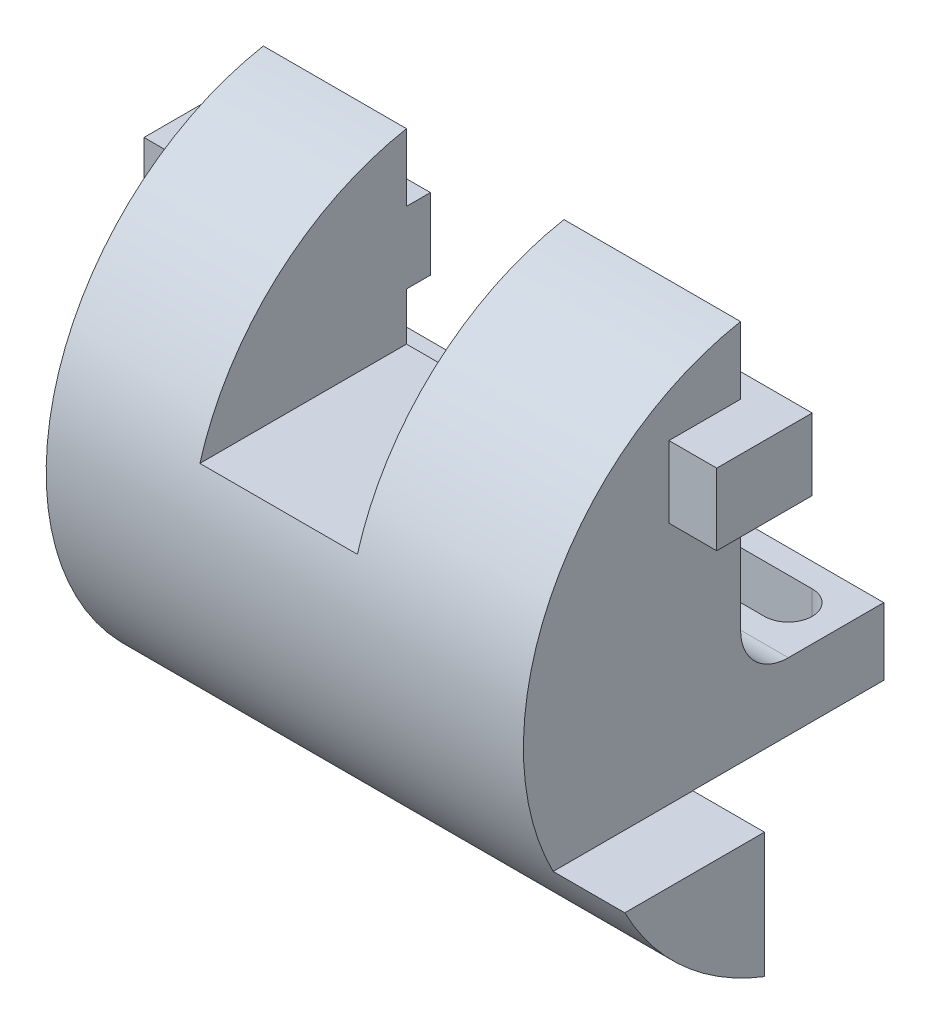
ISO-10303-21;
HEADER;
FILE_DESCRIPTION(('STEP AP214'),'2;1');
FILE_NAME('part.step','',(''),(''),'','','');
FILE_SCHEMA(('AUTOMOTIVE_DESIGN { 1 0 10303 214 1 1 1 1 }'));
ENDSEC;
DATA;
#1=APPLICATION_CONTEXT('core data for automotive mechanical design processes');
#2=APPLICATION_PROTOCOL_DEFINITION('international standard','automotive_design',2000,#1);
#3=PRODUCT_CONTEXT('',#1,'mechanical');
#4=PRODUCT('Part','Part','',(#3));
#5=PRODUCT_RELATED_PRODUCT_CATEGORY('part','',(#4));
#6=PRODUCT_DEFINITION_FORMATION('','',#4);
#7=PRODUCT_DEFINITION_CONTEXT('part definition',#1,'design');
#8=PRODUCT_DEFINITION('design','',#6,#7);
#9=PRODUCT_DEFINITION_SHAPE('','',#8);
#10=(LENGTH_UNIT() NAMED_UNIT(*) SI_UNIT(.MILLI.,.METRE.));
#11=(NAMED_UNIT(*) PLANE_ANGLE_UNIT() SI_UNIT($,.RADIAN.));
#12=(NAMED_UNIT(*) SI_UNIT($,.STERADIAN.) SOLID_ANGLE_UNIT());
#13=UNCERTAINTY_MEASURE_WITH_UNIT(LENGTH_MEASURE(1.E-05),#10,'distance_accuracy_value','');
#14=(GEOMETRIC_REPRESENTATION_CONTEXT(3) GLOBAL_UNCERTAINTY_ASSIGNED_CONTEXT((#13)) GLOBAL_UNIT_ASSIGNED_CONTEXT((#10,
#11,#12)) REPRESENTATION_CONTEXT('',''));
#15=CARTESIAN_POINT('',(0.,0.,0.));
#16=DIRECTION('',(0.,0.,1.));
#17=DIRECTION('',(1.,0.,0.));
#18=AXIS2_PLACEMENT_3D('',#15,#16,#17);
#19=CARTESIAN_POINT('',(115.,-25.7672947235158,10.));
#20=DIRECTION('',(0.,0.,1.));
#21=DIRECTION('',(1.,0.,0.));
#22=AXIS2_PLACEMENT_3D('',#19,#20,#21);
#23=PLANE('',#22);
#24=DIRECTION('',(1.,0.,0.));
#25=VECTOR('',#24,1.);
#26=CARTESIAN_POINT('',(115.,16.1410392458528,10.));
#27=LINE('',#26,#25);
#28=CARTESIAN_POINT('',(63.,16.1410392458528,9.99999999999999));
#29=VERTEX_POINT('',#28);
#30=CARTESIAN_POINT('',(100.,16.1410392458528,10.));
#31=VERTEX_POINT('',#30);
#32=EDGE_CURVE('E302',#29,#31,#27,.T.);
#33=ORIENTED_EDGE('',*,*,#32,.F.);
#34=DIRECTION('',(0.,1.,0.));
#35=VECTOR('',#34,1.);
#36=CARTESIAN_POINT('',(63.,-8.85896075414721,9.99999999999999));
#37=LINE('',#36,#35);
#38=CARTESIAN_POINT('',(63.,30.2327052764842,9.99999999999999));
#39=VERTEX_POINT('',#38);
#40=EDGE_CURVE('E343',#29,#39,#37,.T.);
#41=ORIENTED_EDGE('',*,*,#40,.T.);
#42=DIRECTION('',(-1.,0.,0.));
#43=VECTOR('',#42,1.);
#44=CARTESIAN_POINT('',(115.,30.2327052764842,9.99999999999999));
#45=LINE('',#44,#43);
#46=CARTESIAN_POINT('',(100.,30.2327052764842,10.));
#47=VERTEX_POINT('',#46);
#48=EDGE_CURVE('E408',#47,#39,#45,.T.);
#49=ORIENTED_EDGE('',*,*,#48,.F.);
#50=DIRECTION('',(0.,1.,0.));
#51=VECTOR('',#50,1.);
#52=CARTESIAN_POINT('',(100.,-25.7672947235158,10.));
#53=LINE('',#52,#51);
#54=EDGE_CURVE('E367',#31,#47,#53,.T.);
#55=ORIENTED_EDGE('',*,*,#54,.F.);
#56=EDGE_LOOP('',(#33,#41,#49,#55));
#57=FACE_BOUND('',#56,.T.);
#58=ADVANCED_FACE('F43',(#57),#23,.F.);
#59=CARTESIAN_POINT('',(63.,-8.85896075414721,9.99999999999999));
#60=VERTEX_POINT('',#59);
#61=CARTESIAN_POINT('',(63.,1.14103924585279,9.99999999999999));
#62=VERTEX_POINT('',#61);
#63=EDGE_CURVE('E349',#60,#62,#37,.T.);
#64=ORIENTED_EDGE('',*,*,#63,.T.);
#65=DIRECTION('',(1.,0.,0.));
#66=VECTOR('',#65,1.);
#67=CARTESIAN_POINT('',(115.,1.14103924585279,10.));
#68=LINE('',#67,#66);
#69=CARTESIAN_POINT('',(100.,1.14103924585279,10.));
#70=VERTEX_POINT('',#69);
#71=EDGE_CURVE('E298',#62,#70,#68,.T.);
#72=ORIENTED_EDGE('',*,*,#71,.T.);
#73=CARTESIAN_POINT('',(100.,-25.7672947235158,9.99999999999999));
#74=VERTEX_POINT('',#73);
#75=EDGE_CURVE('E368',#74,#70,#53,.T.);
#76=ORIENTED_EDGE('',*,*,#75,.F.);
#77=DIRECTION('',(-1.,0.,0.));
#78=VECTOR('',#77,1.);
#79=CARTESIAN_POINT('',(115.,-25.7672947235158,10.));
#80=LINE('',#79,#78);
#81=CARTESIAN_POINT('',(0.,-25.7672947235158,10.));
#82=VERTEX_POINT('',#81);
#83=EDGE_CURVE('E411',#74,#82,#80,.T.);
#84=ORIENTED_EDGE('',*,*,#83,.T.);
#85=DIRECTION('',(0.,1.,0.));
#86=VECTOR('',#85,1.);
#87=CARTESIAN_POINT('',(0.,-25.7672947235158,10.));
#88=LINE('',#87,#86);
#89=CARTESIAN_POINT('',(0.,1.14103924585278,10.));
#90=VERTEX_POINT('',#89);
#91=EDGE_CURVE('E386',#82,#90,#88,.T.);
#92=ORIENTED_EDGE('',*,*,#91,.T.);
#93=DIRECTION('',(-1.,0.,0.));
#94=VECTOR('',#93,1.);
#95=CARTESIAN_POINT('',(115.,1.14103924585279,10.));
#96=LINE('',#95,#94);
#97=CARTESIAN_POINT('',(30.,1.14103924585279,9.99999999999999));
#98=VERTEX_POINT('',#97);
#99=EDGE_CURVE('E58',#98,#90,#96,.T.);
#100=ORIENTED_EDGE('',*,*,#99,.F.);
#101=DIRECTION('',(0.,1.,0.));
#102=VECTOR('',#101,1.);
#103=CARTESIAN_POINT('',(30.,-8.85896075414721,9.99999999999999));
#104=LINE('',#103,#102);
#105=CARTESIAN_POINT('',(30.,-8.85896075414721,9.99999999999999));
#106=VERTEX_POINT('',#105);
#107=EDGE_CURVE('E344',#106,#98,#104,.T.);
#108=ORIENTED_EDGE('',*,*,#107,.F.);
#109=DIRECTION('',(-1.,0.,0.));
#110=VECTOR('',#109,1.);
#111=CARTESIAN_POINT('',(30.,-8.85896075414721,9.99999999999999));
#112=LINE('',#111,#110);
#113=EDGE_CURVE('E340',#60,#106,#112,.T.);
#114=ORIENTED_EDGE('',*,*,#113,.F.);
#115=EDGE_LOOP('',(#64,#72,#76,#84,#92,#100,#108,#114));
#116=FACE_BOUND('',#115,.T.);
#117=ADVANCED_FACE('F466',(#116),#23,.F.);
#118=CARTESIAN_POINT('',(100.,0.,0.));
#119=DIRECTION('',(1.,0.,0.));
#120=DIRECTION('',(0.,0.,-1.));
#121=AXIS2_PLACEMENT_3D('',#118,#119,#120);
#122=PLANE('',#121);
#123=DIRECTION('',(0.,1.,0.));
#124=VECTOR('',#123,1.);
#125=CARTESIAN_POINT('',(100.,0.,25.));
#126=LINE('',#125,#124);
#127=CARTESIAN_POINT('',(100.,1.14103924585279,25.));
#128=VERTEX_POINT('',#127);
#129=CARTESIAN_POINT('',(100.,16.1410392458528,25.));
#130=VERTEX_POINT('',#129);
#131=EDGE_CURVE('E66',#128,#130,#126,.T.);
#132=ORIENTED_EDGE('',*,*,#131,.T.);
#133=DIRECTION('',(0.,0.,-1.));
#134=VECTOR('',#133,1.);
#135=CARTESIAN_POINT('',(100.,16.1410392458528,0.));
#136=LINE('',#135,#134);
#137=EDGE_CURVE('E235',#130,#31,#136,.T.);
#138=ORIENTED_EDGE('',*,*,#137,.T.);
#139=ORIENTED_EDGE('',*,*,#54,.T.);
#140=CARTESIAN_POINT('',(100.,-24.3589607541472,0.));
#141=DIRECTION('',(1.,0.,0.));
#142=DIRECTION('',(0.,0.,-1.));
#143=AXIS2_PLACEMENT_3D('',#140,#141,#142);
#144=CIRCLE('',#143,55.5);
#145=CARTESIAN_POINT('',(100.,-49.918480966957,49.2641951775421));
#146=VERTEX_POINT('',#145);
#147=EDGE_CURVE('E370',#47,#146,#144,.T.);
#148=ORIENTED_EDGE('',*,*,#147,.T.);
#149=DIRECTION('',(0.,0.,-1.));
#150=VECTOR('',#149,1.);
#151=CARTESIAN_POINT('',(100.,-49.918480966957,65.4023955633849));
#152=LINE('',#151,#150);
#153=CARTESIAN_POINT('',(100.,-49.918480966957,20.));
#154=VERTEX_POINT('',#153);
#155=EDGE_CURVE('E347',#146,#154,#152,.T.);
#156=ORIENTED_EDGE('',*,*,#155,.T.);
#157=DIRECTION('',(0.,1.,0.));
#158=VECTOR('',#157,1.);
#159=CARTESIAN_POINT('',(100.,-49.8721978622663,20.));
#160=LINE('',#159,#158);
#161=CARTESIAN_POINT('',(100.,-49.8721978622663,20.));
#162=VERTEX_POINT('',#161);
#163=EDGE_CURVE('E361',#154,#162,#160,.T.);
#164=ORIENTED_EDGE('',*,*,#163,.T.);
#165=DIRECTION('',(0.,0.,-1.));
#166=VECTOR('',#165,1.);
#167=CARTESIAN_POINT('',(100.,-49.8721978622663,-20.));
#168=LINE('',#167,#166);
#169=CARTESIAN_POINT('',(100.,-49.8721978622663,-20.));
#170=VERTEX_POINT('',#169);
#171=EDGE_CURVE('E359',#162,#170,#168,.T.);
#172=ORIENTED_EDGE('',*,*,#171,.T.);
#173=DIRECTION('',(0.,1.,0.));
#174=VECTOR('',#173,1.);
#175=CARTESIAN_POINT('',(100.,-35.7672947235158,-20.));
#176=LINE('',#175,#174);
#177=CARTESIAN_POINT('',(100.,-35.7672947235158,-20.));
#178=VERTEX_POINT('',#177);
#179=EDGE_CURVE('E418',#170,#178,#176,.T.);
#180=ORIENTED_EDGE('',*,*,#179,.T.);
#181=DIRECTION('',(0.,0.,1.));
#182=VECTOR('',#181,1.);
#183=CARTESIAN_POINT('',(100.,-35.7672947235158,-20.));
#184=LINE('',#183,#182);
#185=CARTESIAN_POINT('',(100.,-35.7672947235158,0.));
#186=VERTEX_POINT('',#185);
#187=EDGE_CURVE('E363',#178,#186,#184,.T.);
#188=ORIENTED_EDGE('',*,*,#187,.T.);
#189=CARTESIAN_POINT('',(100.,-25.7672947235158,0.));
#190=DIRECTION('',(1.,0.,0.));
#191=DIRECTION('',(0.,0.,-1.));
#192=AXIS2_PLACEMENT_3D('',#189,#190,#191);
#193=CIRCLE('',#192,10.);
#194=EDGE_CURVE('E365',#186,#74,#193,.F.);
#195=ORIENTED_EDGE('',*,*,#194,.T.);
#196=ORIENTED_EDGE('',*,*,#75,.T.);
#197=DIRECTION('',(0.,0.,-1.));
#198=VECTOR('',#197,1.);
#199=CARTESIAN_POINT('',(100.,1.14103924585279,0.));
#200=LINE('',#199,#198);
#201=EDGE_CURVE('E246',#128,#70,#200,.T.);
#202=ORIENTED_EDGE('',*,*,#201,.F.);
#203=EDGE_LOOP('',(#132,#138,#139,#148,#156,#164,#172,#180,#188,#195,#196,#202));
#204=FACE_BOUND('',#203,.T.);
#205=ADVANCED_FACE('F473',(#204),#122,.T.);
#206=CARTESIAN_POINT('',(115.,-35.7672947235158,-20.));
#207=DIRECTION('',(0.,-1.,0.));
#208=DIRECTION('',(0.,0.,-1.));
#209=AXIS2_PLACEMENT_3D('',#206,#207,#208);
#210=PLANE('',#209);
#211=DIRECTION('',(-1.,0.,0.));
#212=VECTOR('',#211,1.);
#213=CARTESIAN_POINT('',(90.,-35.7672947235158,-15.));
#214=LINE('',#213,#212);
#215=CARTESIAN_POINT('',(90.,-35.7672947235158,-15.));
#216=VERTEX_POINT('',#215);
#217=CARTESIAN_POINT('',(10.,-35.7672947235158,-15.));
#218=VERTEX_POINT('',#217);
#219=EDGE_CURVE('E318',#216,#218,#214,.T.);
#220=ORIENTED_EDGE('',*,*,#219,.F.);
#221=CARTESIAN_POINT('',(90.,-35.7672947235158,-10.));
#222=DIRECTION('',(0.,1.,0.));
#223=DIRECTION('',(0.,0.,1.));
#224=AXIS2_PLACEMENT_3D('',#221,#222,#223);
#225=CIRCLE('',#224,5.);
#226=CARTESIAN_POINT('',(90.,-35.7672947235158,-5.00000000000002));
#227=VERTEX_POINT('',#226);
#228=EDGE_CURVE('E316',#227,#216,#225,.T.);
#229=ORIENTED_EDGE('',*,*,#228,.F.);
#230=DIRECTION('',(1.,0.,0.));
#231=VECTOR('',#230,1.);
#232=CARTESIAN_POINT('',(90.,-35.7672947235158,-5.00000000000002));
#233=LINE('',#232,#231);
#234=CARTESIAN_POINT('',(10.,-35.7672947235158,-5.00000000000001));
#235=VERTEX_POINT('',#234);
#236=EDGE_CURVE('E324',#235,#227,#233,.T.);
#237=ORIENTED_EDGE('',*,*,#236,.F.);
#238=CARTESIAN_POINT('',(10.,-35.7672947235158,-10.));
#239=DIRECTION('',(0.,1.,0.));
#240=DIRECTION('',(0.,0.,1.));
#241=AXIS2_PLACEMENT_3D('',#238,#239,#240);
#242=CIRCLE('',#241,5.);
#243=EDGE_CURVE('E321',#218,#235,#242,.T.);
#244=ORIENTED_EDGE('',*,*,#243,.F.);
#245=EDGE_LOOP('',(#220,#229,#237,#244));
#246=FACE_BOUND('',#245,.T.);
#247=ORIENTED_EDGE('',*,*,#187,.F.);
#248=DIRECTION('',(-1.,0.,0.));
#249=VECTOR('',#248,1.);
#250=CARTESIAN_POINT('',(115.,-35.7672947235158,-20.));
#251=LINE('',#250,#249);
#252=CARTESIAN_POINT('',(0.,-35.7672947235158,-20.));
#253=VERTEX_POINT('',#252);
#254=EDGE_CURVE('E379',#178,#253,#251,.T.);
#255=ORIENTED_EDGE('',*,*,#254,.T.);
#256=DIRECTION('',(0.,0.,1.));
#257=VECTOR('',#256,1.);
#258=CARTESIAN_POINT('',(0.,-35.7672947235158,-20.));
#259=LINE('',#258,#257);
#260=CARTESIAN_POINT('',(0.,-35.7672947235158,0.));
#261=VERTEX_POINT('',#260);
#262=EDGE_CURVE('E372',#253,#261,#259,.T.);
#263=ORIENTED_EDGE('',*,*,#262,.T.);
#264=DIRECTION('',(-1.,0.,0.));
#265=VECTOR('',#264,1.);
#266=CARTESIAN_POINT('',(115.,-35.7672947235158,0.));
#267=LINE('',#266,#265);
#268=EDGE_CURVE('E413',#186,#261,#267,.T.);
#269=ORIENTED_EDGE('',*,*,#268,.F.);
#270=EDGE_LOOP('',(#247,#255,#263,#269));
#271=FACE_BOUND('',#270,.T.);
#272=ADVANCED_FACE('F45',(#246,#271),#210,.F.);
#273=CARTESIAN_POINT('',(115.,-25.7672947235158,0.));
#274=DIRECTION('',(-1.,0.,0.));
#275=DIRECTION('',(0.,0.,1.));
#276=AXIS2_PLACEMENT_3D('',#273,#274,#275);
#277=CYLINDRICAL_SURFACE('',#276,10.);
#278=ORIENTED_EDGE('',*,*,#194,.F.);
#279=ORIENTED_EDGE('',*,*,#268,.T.);
#280=CARTESIAN_POINT('',(0.,-25.7672947235158,0.));
#281=DIRECTION('',(-1.,0.,0.));
#282=DIRECTION('',(0.,0.,1.));
#283=AXIS2_PLACEMENT_3D('',#280,#281,#282);
#284=CIRCLE('',#283,10.);
#285=EDGE_CURVE('E382',#261,#82,#284,.T.);
#286=ORIENTED_EDGE('',*,*,#285,.T.);
#287=ORIENTED_EDGE('',*,*,#83,.F.);
#288=EDGE_LOOP('',(#278,#279,#286,#287));
#289=FACE_BOUND('',#288,.T.);
#290=ADVANCED_FACE('F477',(#289),#277,.F.);
#291=CARTESIAN_POINT('',(30.,16.1410392458528,9.99999999999999));
#292=VERTEX_POINT('',#291);
#293=CARTESIAN_POINT('',(30.,30.2327052764842,9.99999999999999));
#294=VERTEX_POINT('',#293);
#295=EDGE_CURVE('E348',#292,#294,#104,.T.);
#296=ORIENTED_EDGE('',*,*,#295,.F.);
#297=DIRECTION('',(-1.,0.,0.));
#298=VECTOR('',#297,1.);
#299=CARTESIAN_POINT('',(115.,16.1410392458528,10.));
#300=LINE('',#299,#298);
#301=CARTESIAN_POINT('',(0.,16.1410392458528,9.99999999999999));
#302=VERTEX_POINT('',#301);
#303=EDGE_CURVE('E310',#292,#302,#300,.T.);
#304=ORIENTED_EDGE('',*,*,#303,.T.);
#305=CARTESIAN_POINT('',(0.,30.2327052764842,9.99999999999999));
#306=VERTEX_POINT('',#305);
#307=EDGE_CURVE('E385',#302,#306,#88,.T.);
#308=ORIENTED_EDGE('',*,*,#307,.T.);
#309=EDGE_CURVE('E407',#294,#306,#45,.T.);
#310=ORIENTED_EDGE('',*,*,#309,.F.);
#311=EDGE_LOOP('',(#296,#304,#308,#310));
#312=FACE_BOUND('',#311,.T.);
#313=ADVANCED_FACE('F469',(#312),#23,.F.);
#314=CARTESIAN_POINT('',(115.,-49.8721978622663,-20.));
#315=DIRECTION('',(0.,1.,0.));
#316=DIRECTION('',(0.,0.,1.));
#317=AXIS2_PLACEMENT_3D('',#314,#315,#316);
#318=PLANE('',#317);
#319=DIRECTION('',(1.,0.,0.));
#320=VECTOR('',#319,1.);
#321=CARTESIAN_POINT('',(115.,-49.8721978622663,-5.00000000000002));
#322=LINE('',#321,#320);
#323=CARTESIAN_POINT('',(10.,-49.8721978622663,-5.00000000000001));
#324=VERTEX_POINT('',#323);
#325=CARTESIAN_POINT('',(90.,-49.8721978622663,-5.00000000000002));
#326=VERTEX_POINT('',#325);
#327=EDGE_CURVE('E51',#324,#326,#322,.T.);
#328=ORIENTED_EDGE('',*,*,#327,.T.);
#329=CARTESIAN_POINT('',(90.,-49.8721978622663,-10.));
#330=DIRECTION('',(0.,1.,0.));
#331=DIRECTION('',(0.,0.,1.));
#332=AXIS2_PLACEMENT_3D('',#329,#330,#331);
#333=CIRCLE('',#332,5.);
#334=CARTESIAN_POINT('',(90.,-49.8721978622663,-15.));
#335=VERTEX_POINT('',#334);
#336=EDGE_CURVE('E11',#326,#335,#333,.T.);
#337=ORIENTED_EDGE('',*,*,#336,.T.);
#338=DIRECTION('',(-1.,0.,0.));
#339=VECTOR('',#338,1.);
#340=CARTESIAN_POINT('',(115.,-49.8721978622663,-15.));
#341=LINE('',#340,#339);
#342=CARTESIAN_POINT('',(10.,-49.8721978622663,-15.));
#343=VERTEX_POINT('',#342);
#344=EDGE_CURVE('E428',#335,#343,#341,.T.);
#345=ORIENTED_EDGE('',*,*,#344,.T.);
#346=CARTESIAN_POINT('',(10.,-49.8721978622663,-10.));
#347=DIRECTION('',(0.,1.,0.));
#348=DIRECTION('',(0.,0.,1.));
#349=AXIS2_PLACEMENT_3D('',#346,#347,#348);
#350=CIRCLE('',#349,5.);
#351=EDGE_CURVE('E431',#343,#324,#350,.T.);
#352=ORIENTED_EDGE('',*,*,#351,.T.);
#353=EDGE_LOOP('',(#328,#337,#345,#352));
#354=FACE_BOUND('',#353,.T.);
#355=ORIENTED_EDGE('',*,*,#171,.F.);
#356=DIRECTION('',(-1.,0.,0.));
#357=VECTOR('',#356,1.);
#358=CARTESIAN_POINT('',(115.,-49.8721978622663,20.));
#359=LINE('',#358,#357);
#360=CARTESIAN_POINT('',(0.,-49.8721978622663,20.));
#361=VERTEX_POINT('',#360);
#362=EDGE_CURVE('E402',#162,#361,#359,.T.);
#363=ORIENTED_EDGE('',*,*,#362,.T.);
#364=DIRECTION('',(0.,0.,-1.));
#365=VECTOR('',#364,1.);
#366=CARTESIAN_POINT('',(0.,-49.8721978622663,-20.));
#367=LINE('',#366,#365);
#368=CARTESIAN_POINT('',(0.,-49.8721978622663,-20.));
#369=VERTEX_POINT('',#368);
#370=EDGE_CURVE('E394',#361,#369,#367,.T.);
#371=ORIENTED_EDGE('',*,*,#370,.T.);
#372=DIRECTION('',(-1.,0.,0.));
#373=VECTOR('',#372,1.);
#374=CARTESIAN_POINT('',(115.,-49.8721978622663,-20.));
#375=LINE('',#374,#373);
#376=EDGE_CURVE('E400',#170,#369,#375,.T.);
#377=ORIENTED_EDGE('',*,*,#376,.F.);
#378=EDGE_LOOP('',(#355,#363,#371,#377));
#379=FACE_BOUND('',#378,.T.);
#380=ADVANCED_FACE('F435',(#354,#379),#318,.F.);
#381=CARTESIAN_POINT('',(115.,-35.7672947235158,-20.));
#382=DIRECTION('',(0.,0.,1.));
#383=DIRECTION('',(1.,0.,0.));
#384=AXIS2_PLACEMENT_3D('',#381,#382,#383);
#385=PLANE('',#384);
#386=ORIENTED_EDGE('',*,*,#179,.F.);
#387=ORIENTED_EDGE('',*,*,#376,.T.);
#388=DIRECTION('',(0.,1.,0.));
#389=VECTOR('',#388,1.);
#390=CARTESIAN_POINT('',(0.,-35.7672947235158,-20.));
#391=LINE('',#390,#389);
#392=EDGE_CURVE('E376',#369,#253,#391,.T.);
#393=ORIENTED_EDGE('',*,*,#392,.T.);
#394=ORIENTED_EDGE('',*,*,#254,.F.);
#395=EDGE_LOOP('',(#386,#387,#393,#394));
#396=FACE_BOUND('',#395,.T.);
#397=ADVANCED_FACE('F484',(#396),#385,.F.);
#398=CARTESIAN_POINT('',(115.,-24.3589607541472,0.));
#399=DIRECTION('',(-1.,0.,0.));
#400=DIRECTION('',(0.,0.,1.));
#401=AXIS2_PLACEMENT_3D('',#398,#399,#400);
#402=CYLINDRICAL_SURFACE('',#401,55.5);
#403=DIRECTION('',(-1.,0.,0.));
#404=VECTOR('',#403,1.);
#405=CARTESIAN_POINT('',(115.,-8.85896075414721,53.2916503778969));
#406=LINE('',#405,#404);
#407=CARTESIAN_POINT('',(30.,-8.85896075414721,53.2916503778969));
#408=VERTEX_POINT('',#407);
#409=CARTESIAN_POINT('',(63.,-8.85896075414721,53.2916503778969));
#410=VERTEX_POINT('',#409);
#411=EDGE_CURVE('E420',#408,#410,#406,.F.);
#412=ORIENTED_EDGE('',*,*,#411,.F.);
#413=CARTESIAN_POINT('',(30.,-24.3589607541472,0.));
#414=DIRECTION('',(-1.,0.,0.));
#415=DIRECTION('',(0.,0.,1.));
#416=AXIS2_PLACEMENT_3D('',#413,#414,#415);
#417=CIRCLE('',#416,55.5);
#418=EDGE_CURVE('E425',#408,#294,#417,.T.);
#419=ORIENTED_EDGE('',*,*,#418,.T.);
#420=ORIENTED_EDGE('',*,*,#309,.T.);
#421=CARTESIAN_POINT('',(0.,-24.3589607541472,0.));
#422=DIRECTION('',(1.,0.,0.));
#423=DIRECTION('',(0.,0.,-1.));
#424=AXIS2_PLACEMENT_3D('',#421,#422,#423);
#425=CIRCLE('',#424,55.5);
#426=CARTESIAN_POINT('',(0.,-76.1300917056727,20.));
#427=VERTEX_POINT('',#426);
#428=EDGE_CURVE('E389',#306,#427,#425,.T.);
#429=ORIENTED_EDGE('',*,*,#428,.T.);
#430=DIRECTION('',(-1.,0.,0.));
#431=VECTOR('',#430,1.);
#432=CARTESIAN_POINT('',(115.,-76.1300917056727,20.));
#433=LINE('',#432,#431);
#434=CARTESIAN_POINT('',(115.,-76.1300917056727,20.));
#435=VERTEX_POINT('',#434);
#436=EDGE_CURVE('E404',#435,#427,#433,.T.);
#437=ORIENTED_EDGE('',*,*,#436,.F.);
#438=CARTESIAN_POINT('',(115.,-24.3589607541472,0.));
#439=DIRECTION('',(1.,0.,0.));
#440=DIRECTION('',(0.,0.,-1.));
#441=AXIS2_PLACEMENT_3D('',#438,#439,#440);
#442=CIRCLE('',#441,55.5);
#443=CARTESIAN_POINT('',(115.,-49.918480966957,49.2641951775421));
#444=VERTEX_POINT('',#443);
#445=EDGE_CURVE('E373',#444,#435,#442,.T.);
#446=ORIENTED_EDGE('',*,*,#445,.F.);
#447=DIRECTION('',(-1.,0.,0.));
#448=VECTOR('',#447,1.);
#449=CARTESIAN_POINT('',(115.,-49.918480966957,49.2641951775421));
#450=LINE('',#449,#448);
#451=EDGE_CURVE('E356',#444,#146,#450,.T.);
#452=ORIENTED_EDGE('',*,*,#451,.T.);
#453=ORIENTED_EDGE('',*,*,#147,.F.);
#454=ORIENTED_EDGE('',*,*,#48,.T.);
#455=CARTESIAN_POINT('',(63.,-24.3589607541472,0.));
#456=DIRECTION('',(1.,0.,0.));
#457=DIRECTION('',(0.,0.,-1.));
#458=AXIS2_PLACEMENT_3D('',#455,#456,#457);
#459=CIRCLE('',#458,55.5);
#460=EDGE_CURVE('E422',#39,#410,#459,.T.);
#461=ORIENTED_EDGE('',*,*,#460,.T.);
#462=EDGE_LOOP('',(#412,#419,#420,#429,#437,#446,#452,#453,#454,#461));
#463=FACE_BOUND('',#462,.T.);
#464=ADVANCED_FACE('F499',(#463),#402,.T.);
#465=CARTESIAN_POINT('',(115.,-49.8721978622663,20.));
#466=DIRECTION('',(0.,0.,1.));
#467=DIRECTION('',(0.,-1.,0.));
#468=AXIS2_PLACEMENT_3D('',#465,#466,#467);
#469=PLANE('',#468);
#470=ORIENTED_EDGE('',*,*,#163,.F.);
#471=DIRECTION('',(1.,0.,0.));
#472=VECTOR('',#471,1.);
#473=CARTESIAN_POINT('',(115.,-49.918480966957,20.));
#474=LINE('',#473,#472);
#475=CARTESIAN_POINT('',(115.,-49.918480966957,20.));
#476=VERTEX_POINT('',#475);
#477=EDGE_CURVE('E353',#154,#476,#474,.T.);
#478=ORIENTED_EDGE('',*,*,#477,.T.);
#479=DIRECTION('',(0.,1.,0.));
#480=VECTOR('',#479,1.);
#481=CARTESIAN_POINT('',(115.,-49.8721978622663,20.));
#482=LINE('',#481,#480);
#483=EDGE_CURVE('E375',#435,#476,#482,.T.);
#484=ORIENTED_EDGE('',*,*,#483,.F.);
#485=ORIENTED_EDGE('',*,*,#436,.T.);
#486=DIRECTION('',(0.,1.,0.));
#487=VECTOR('',#486,1.);
#488=CARTESIAN_POINT('',(0.,-49.8721978622663,20.));
#489=LINE('',#488,#487);
#490=EDGE_CURVE('E391',#427,#361,#489,.T.);
#491=ORIENTED_EDGE('',*,*,#490,.T.);
#492=ORIENTED_EDGE('',*,*,#362,.F.);
#493=EDGE_LOOP('',(#470,#478,#484,#485,#491,#492));
#494=FACE_BOUND('',#493,.T.);
#495=ADVANCED_FACE('F536',(#494),#469,.F.);
#496=CARTESIAN_POINT('',(115.,-25.7672947235158,0.));
#497=DIRECTION('',(-1.,0.,0.));
#498=DIRECTION('',(0.,0.,1.));
#499=AXIS2_PLACEMENT_3D('',#496,#497,#498);
#500=PLANE('',#499);
#501=ORIENTED_EDGE('',*,*,#483,.T.);
#502=DIRECTION('',(0.,0.,1.));
#503=VECTOR('',#502,1.);
#504=CARTESIAN_POINT('',(115.,-49.918480966957,0.));
#505=LINE('',#504,#503);
#506=EDGE_CURVE('E415',#476,#444,#505,.T.);
#507=ORIENTED_EDGE('',*,*,#506,.T.);
#508=ORIENTED_EDGE('',*,*,#445,.T.);
#509=EDGE_LOOP('',(#501,#507,#508));
#510=FACE_BOUND('',#509,.T.);
#511=ADVANCED_FACE('F539',(#510),#500,.F.);
#512=CARTESIAN_POINT('',(0.,-25.7672947235158,0.));
#513=DIRECTION('',(-1.,0.,0.));
#514=DIRECTION('',(0.,0.,1.));
#515=AXIS2_PLACEMENT_3D('',#512,#513,#514);
#516=PLANE('',#515);
#517=DIRECTION('',(0.,0.,-1.));
#518=VECTOR('',#517,1.);
#519=CARTESIAN_POINT('',(0.,16.1410392458528,0.));
#520=LINE('',#519,#518);
#521=CARTESIAN_POINT('',(0.,16.1410392458528,25.));
#522=VERTEX_POINT('',#521);
#523=EDGE_CURVE('E308',#522,#302,#520,.T.);
#524=ORIENTED_EDGE('',*,*,#523,.F.);
#525=DIRECTION('',(0.,-1.,0.));
#526=VECTOR('',#525,1.);
#527=CARTESIAN_POINT('',(0.,-25.7672947235158,25.));
#528=LINE('',#527,#526);
#529=CARTESIAN_POINT('',(0.,1.14103924585279,25.));
#530=VERTEX_POINT('',#529);
#531=EDGE_CURVE('E313',#522,#530,#528,.T.);
#532=ORIENTED_EDGE('',*,*,#531,.T.);
#533=DIRECTION('',(0.,0.,-1.));
#534=VECTOR('',#533,1.);
#535=CARTESIAN_POINT('',(0.,1.14103924585279,0.));
#536=LINE('',#535,#534);
#537=EDGE_CURVE('E305',#530,#90,#536,.T.);
#538=ORIENTED_EDGE('',*,*,#537,.T.);
#539=ORIENTED_EDGE('',*,*,#91,.F.);
#540=ORIENTED_EDGE('',*,*,#285,.F.);
#541=ORIENTED_EDGE('',*,*,#262,.F.);
#542=ORIENTED_EDGE('',*,*,#392,.F.);
#543=ORIENTED_EDGE('',*,*,#370,.F.);
#544=ORIENTED_EDGE('',*,*,#490,.F.);
#545=ORIENTED_EDGE('',*,*,#428,.F.);
#546=ORIENTED_EDGE('',*,*,#307,.F.);
#547=EDGE_LOOP('',(#524,#532,#538,#539,#540,#541,#542,#543,#544,#545,#546));
#548=FACE_BOUND('',#547,.T.);
#549=ADVANCED_FACE('F528',(#548),#516,.T.);
#550=CARTESIAN_POINT('',(100.,-49.918480966957,65.4023955633849));
#551=DIRECTION('',(0.,-1.,0.));
#552=DIRECTION('',(0.,0.,-1.));
#553=AXIS2_PLACEMENT_3D('',#550,#551,#552);
#554=PLANE('',#553);
#555=ORIENTED_EDGE('',*,*,#506,.F.);
#556=ORIENTED_EDGE('',*,*,#477,.F.);
#557=ORIENTED_EDGE('',*,*,#155,.F.);
#558=ORIENTED_EDGE('',*,*,#451,.F.);
#559=EDGE_LOOP('',(#555,#556,#557,#558));
#560=FACE_BOUND('',#559,.T.);
#561=ADVANCED_FACE('F544',(#560),#554,.F.);
#562=CARTESIAN_POINT('',(30.,-8.85896075414721,9.99999999999999));
#563=DIRECTION('',(-1.,0.,0.));
#564=DIRECTION('',(0.,0.,1.));
#565=AXIS2_PLACEMENT_3D('',#562,#563,#564);
#566=PLANE('',#565);
#567=ORIENTED_EDGE('',*,*,#107,.T.);
#568=DIRECTION('',(0.,0.,-1.));
#569=VECTOR('',#568,1.);
#570=CARTESIAN_POINT('',(30.,1.14103924585279,25.));
#571=LINE('',#570,#569);
#572=CARTESIAN_POINT('',(30.,1.14103924585279,4.99999999999999));
#573=VERTEX_POINT('',#572);
#574=EDGE_CURVE('E261',#98,#573,#571,.T.);
#575=ORIENTED_EDGE('',*,*,#574,.T.);
#576=DIRECTION('',(0.,-1.,0.));
#577=VECTOR('',#576,1.);
#578=CARTESIAN_POINT('',(30.,16.1410392458528,4.99999999999999));
#579=LINE('',#578,#577);
#580=CARTESIAN_POINT('',(30.,16.1410392458528,4.99999999999999));
#581=VERTEX_POINT('',#580);
#582=EDGE_CURVE('E270',#581,#573,#579,.T.);
#583=ORIENTED_EDGE('',*,*,#582,.F.);
#584=DIRECTION('',(0.,0.,-1.));
#585=VECTOR('',#584,1.);
#586=CARTESIAN_POINT('',(30.,16.1410392458528,25.));
#587=LINE('',#586,#585);
#588=EDGE_CURVE('E284',#292,#581,#587,.T.);
#589=ORIENTED_EDGE('',*,*,#588,.F.);
#590=ORIENTED_EDGE('',*,*,#295,.T.);
#591=ORIENTED_EDGE('',*,*,#418,.F.);
#592=DIRECTION('',(0.,0.,1.));
#593=VECTOR('',#592,1.);
#594=CARTESIAN_POINT('',(30.,-8.85896075414721,9.99999999999999));
#595=LINE('',#594,#593);
#596=EDGE_CURVE('E330',#106,#408,#595,.T.);
#597=ORIENTED_EDGE('',*,*,#596,.F.);
#598=EDGE_LOOP('',(#567,#575,#583,#589,#590,#591,#597));
#599=FACE_BOUND('',#598,.T.);
#600=ADVANCED_FACE('F495',(#599),#566,.F.);
#601=CARTESIAN_POINT('',(63.,-8.85896075414721,9.99999999999999));
#602=DIRECTION('',(1.,0.,0.));
#603=DIRECTION('',(0.,0.,-1.));
#604=AXIS2_PLACEMENT_3D('',#601,#602,#603);
#605=PLANE('',#604);
#606=ORIENTED_EDGE('',*,*,#40,.F.);
#607=DIRECTION('',(0.,0.,1.));
#608=VECTOR('',#607,1.);
#609=CARTESIAN_POINT('',(63.,16.1410392458528,25.));
#610=LINE('',#609,#608);
#611=CARTESIAN_POINT('',(63.,16.1410392458528,5.00000000000002));
#612=VERTEX_POINT('',#611);
#613=EDGE_CURVE('E237',#612,#29,#610,.T.);
#614=ORIENTED_EDGE('',*,*,#613,.F.);
#615=DIRECTION('',(0.,-1.,0.));
#616=VECTOR('',#615,1.);
#617=CARTESIAN_POINT('',(63.,16.1410392458528,5.00000000000002));
#618=LINE('',#617,#616);
#619=CARTESIAN_POINT('',(63.,1.14103924585279,5.00000000000002));
#620=VERTEX_POINT('',#619);
#621=EDGE_CURVE('E254',#612,#620,#618,.T.);
#622=ORIENTED_EDGE('',*,*,#621,.T.);
#623=DIRECTION('',(0.,0.,1.));
#624=VECTOR('',#623,1.);
#625=CARTESIAN_POINT('',(63.,1.14103924585279,25.));
#626=LINE('',#625,#624);
#627=EDGE_CURVE('E258',#620,#62,#626,.T.);
#628=ORIENTED_EDGE('',*,*,#627,.T.);
#629=ORIENTED_EDGE('',*,*,#63,.F.);
#630=DIRECTION('',(0.,0.,-1.));
#631=VECTOR('',#630,1.);
#632=CARTESIAN_POINT('',(63.,-8.85896075414721,9.99999999999999));
#633=LINE('',#632,#631);
#634=EDGE_CURVE('E338',#410,#60,#633,.T.);
#635=ORIENTED_EDGE('',*,*,#634,.F.);
#636=ORIENTED_EDGE('',*,*,#460,.F.);
#637=EDGE_LOOP('',(#606,#614,#622,#628,#629,#635,#636));
#638=FACE_BOUND('',#637,.T.);
#639=ADVANCED_FACE('F508',(#638),#605,.F.);
#640=CARTESIAN_POINT('',(0.,-8.85896075414721,0.));
#641=DIRECTION('',(0.,1.,0.));
#642=DIRECTION('',(0.,0.,1.));
#643=AXIS2_PLACEMENT_3D('',#640,#641,#642);
#644=PLANE('',#643);
#645=ORIENTED_EDGE('',*,*,#411,.T.);
#646=ORIENTED_EDGE('',*,*,#634,.T.);
#647=ORIENTED_EDGE('',*,*,#113,.T.);
#648=ORIENTED_EDGE('',*,*,#596,.T.);
#649=EDGE_LOOP('',(#645,#646,#647,#648));
#650=FACE_BOUND('',#649,.T.);
#651=ADVANCED_FACE('F504',(#650),#644,.T.);
#652=CARTESIAN_POINT('',(90.,-76.1300917056727,-10.));
#653=DIRECTION('',(0.,1.,0.));
#654=DIRECTION('',(0.,0.,1.));
#655=AXIS2_PLACEMENT_3D('',#652,#653,#654);
#656=CYLINDRICAL_SURFACE('',#655,5.);
#657=DIRECTION('',(0.,1.,0.));
#658=VECTOR('',#657,1.);
#659=CARTESIAN_POINT('',(90.,-76.1300917056727,-5.00000000000002));
#660=LINE('',#659,#658);
#661=EDGE_CURVE('E328',#326,#227,#660,.T.);
#662=ORIENTED_EDGE('',*,*,#661,.T.);
#663=ORIENTED_EDGE('',*,*,#228,.T.);
#664=DIRECTION('',(0.,1.,0.));
#665=VECTOR('',#664,1.);
#666=CARTESIAN_POINT('',(90.,-76.1300917056727,-15.));
#667=LINE('',#666,#665);
#668=EDGE_CURVE('E327',#335,#216,#667,.T.);
#669=ORIENTED_EDGE('',*,*,#668,.F.);
#670=ORIENTED_EDGE('',*,*,#336,.F.);
#671=EDGE_LOOP('',(#662,#663,#669,#670));
#672=FACE_BOUND('',#671,.T.);
#673=ADVANCED_FACE('F452',(#672),#656,.F.);
#674=CARTESIAN_POINT('',(90.,-76.1300917056727,-5.00000000000002));
#675=DIRECTION('',(0.,0.,1.));
#676=DIRECTION('',(1.,0.,0.));
#677=AXIS2_PLACEMENT_3D('',#674,#675,#676);
#678=PLANE('',#677);
#679=DIRECTION('',(0.,1.,0.));
#680=VECTOR('',#679,1.);
#681=CARTESIAN_POINT('',(10.,-76.1300917056727,-5.00000000000001));
#682=LINE('',#681,#680);
#683=EDGE_CURVE('E331',#324,#235,#682,.T.);
#684=ORIENTED_EDGE('',*,*,#683,.T.);
#685=ORIENTED_EDGE('',*,*,#236,.T.);
#686=ORIENTED_EDGE('',*,*,#661,.F.);
#687=ORIENTED_EDGE('',*,*,#327,.F.);
#688=EDGE_LOOP('',(#684,#685,#686,#687));
#689=FACE_BOUND('',#688,.T.);
#690=ADVANCED_FACE('F441',(#689),#678,.F.);
#691=CARTESIAN_POINT('',(10.,-76.1300917056727,-10.));
#692=DIRECTION('',(0.,1.,0.));
#693=DIRECTION('',(0.,0.,1.));
#694=AXIS2_PLACEMENT_3D('',#691,#692,#693);
#695=CYLINDRICAL_SURFACE('',#694,5.);
#696=DIRECTION('',(0.,1.,0.));
#697=VECTOR('',#696,1.);
#698=CARTESIAN_POINT('',(10.,-76.1300917056727,-15.));
#699=LINE('',#698,#697);
#700=EDGE_CURVE('E333',#343,#218,#699,.T.);
#701=ORIENTED_EDGE('',*,*,#700,.T.);
#702=ORIENTED_EDGE('',*,*,#243,.T.);
#703=ORIENTED_EDGE('',*,*,#683,.F.);
#704=ORIENTED_EDGE('',*,*,#351,.F.);
#705=EDGE_LOOP('',(#701,#702,#703,#704));
#706=FACE_BOUND('',#705,.T.);
#707=ADVANCED_FACE('F443',(#706),#695,.F.);
#708=CARTESIAN_POINT('',(90.,-76.1300917056727,-15.));
#709=DIRECTION('',(0.,0.,-1.));
#710=DIRECTION('',(-1.,0.,0.));
#711=AXIS2_PLACEMENT_3D('',#708,#709,#710);
#712=PLANE('',#711);
#713=ORIENTED_EDGE('',*,*,#668,.T.);
#714=ORIENTED_EDGE('',*,*,#219,.T.);
#715=ORIENTED_EDGE('',*,*,#700,.F.);
#716=ORIENTED_EDGE('',*,*,#344,.F.);
#717=EDGE_LOOP('',(#713,#714,#715,#716));
#718=FACE_BOUND('',#717,.T.);
#719=ADVANCED_FACE('F454',(#718),#712,.F.);
#720=CARTESIAN_POINT('',(0.,16.1410392458528,0.));
#721=DIRECTION('',(0.,-1.,0.));
#722=DIRECTION('',(0.,0.,-1.));
#723=AXIS2_PLACEMENT_3D('',#720,#721,#722);
#724=PLANE('',#723);
#725=ORIENTED_EDGE('',*,*,#613,.T.);
#726=ORIENTED_EDGE('',*,*,#32,.T.);
#727=ORIENTED_EDGE('',*,*,#137,.F.);
#728=DIRECTION('',(1.,0.,0.));
#729=VECTOR('',#728,1.);
#730=CARTESIAN_POINT('',(63.,16.1410392458528,25.));
#731=LINE('',#730,#729);
#732=CARTESIAN_POINT('',(110.,16.1410392458528,25.));
#733=VERTEX_POINT('',#732);
#734=EDGE_CURVE('E227',#130,#733,#731,.T.);
#735=ORIENTED_EDGE('',*,*,#734,.T.);
#736=DIRECTION('',(0.,0.,-1.));
#737=VECTOR('',#736,1.);
#738=CARTESIAN_POINT('',(110.,16.1410392458528,25.));
#739=LINE('',#738,#737);
#740=CARTESIAN_POINT('',(110.,16.1410392458528,5.00000000000003));
#741=VERTEX_POINT('',#740);
#742=EDGE_CURVE('E232',#733,#741,#739,.T.);
#743=ORIENTED_EDGE('',*,*,#742,.T.);
#744=DIRECTION('',(-1.,0.,0.));
#745=VECTOR('',#744,1.);
#746=CARTESIAN_POINT('',(63.,16.1410392458528,5.00000000000002));
#747=LINE('',#746,#745);
#748=EDGE_CURVE('E252',#741,#612,#747,.T.);
#749=ORIENTED_EDGE('',*,*,#748,.T.);
#750=EDGE_LOOP('',(#725,#726,#727,#735,#743,#749));
#751=FACE_BOUND('',#750,.T.);
#752=ADVANCED_FACE('F230',(#751),#724,.F.);
#753=CARTESIAN_POINT('',(0.,1.14103924585279,0.));
#754=DIRECTION('',(0.,-1.,0.));
#755=DIRECTION('',(0.,0.,-1.));
#756=AXIS2_PLACEMENT_3D('',#753,#754,#755);
#757=PLANE('',#756);
#758=ORIENTED_EDGE('',*,*,#71,.F.);
#759=ORIENTED_EDGE('',*,*,#627,.F.);
#760=DIRECTION('',(-1.,0.,0.));
#761=VECTOR('',#760,1.);
#762=CARTESIAN_POINT('',(63.,1.14103924585279,5.00000000000002));
#763=LINE('',#762,#761);
#764=CARTESIAN_POINT('',(110.,1.14103924585279,5.00000000000003));
#765=VERTEX_POINT('',#764);
#766=EDGE_CURVE('E265',#765,#620,#763,.T.);
#767=ORIENTED_EDGE('',*,*,#766,.F.);
#768=DIRECTION('',(0.,0.,-1.));
#769=VECTOR('',#768,1.);
#770=CARTESIAN_POINT('',(110.,1.14103924585279,25.));
#771=LINE('',#770,#769);
#772=CARTESIAN_POINT('',(110.,1.14103924585279,25.));
#773=VERTEX_POINT('',#772);
#774=EDGE_CURVE('E263',#773,#765,#771,.T.);
#775=ORIENTED_EDGE('',*,*,#774,.F.);
#776=DIRECTION('',(1.,0.,0.));
#777=VECTOR('',#776,1.);
#778=CARTESIAN_POINT('',(63.,1.14103924585279,25.));
#779=LINE('',#778,#777);
#780=EDGE_CURVE('E243',#128,#773,#779,.T.);
#781=ORIENTED_EDGE('',*,*,#780,.F.);
#782=ORIENTED_EDGE('',*,*,#201,.T.);
#783=EDGE_LOOP('',(#758,#759,#767,#775,#781,#782));
#784=FACE_BOUND('',#783,.T.);
#785=ADVANCED_FACE('F462',(#784),#757,.T.);
#786=CARTESIAN_POINT('',(63.,16.1410392458528,25.));
#787=DIRECTION('',(0.,0.,-1.));
#788=DIRECTION('',(-1.,0.,0.));
#789=AXIS2_PLACEMENT_3D('',#786,#787,#788);
#790=PLANE('',#789);
#791=ORIENTED_EDGE('',*,*,#131,.F.);
#792=ORIENTED_EDGE('',*,*,#780,.T.);
#793=DIRECTION('',(0.,-1.,0.));
#794=VECTOR('',#793,1.);
#795=CARTESIAN_POINT('',(110.,16.1410392458528,25.));
#796=LINE('',#795,#794);
#797=EDGE_CURVE('E240',#733,#773,#796,.T.);
#798=ORIENTED_EDGE('',*,*,#797,.F.);
#799=ORIENTED_EDGE('',*,*,#734,.F.);
#800=EDGE_LOOP('',(#791,#792,#798,#799));
#801=FACE_BOUND('',#800,.T.);
#802=ADVANCED_FACE('F241',(#801),#790,.F.);
#803=CARTESIAN_POINT('',(110.,16.1410392458528,25.));
#804=DIRECTION('',(-1.,0.,0.));
#805=DIRECTION('',(0.,0.,1.));
#806=AXIS2_PLACEMENT_3D('',#803,#804,#805);
#807=PLANE('',#806);
#808=ORIENTED_EDGE('',*,*,#774,.T.);
#809=DIRECTION('',(0.,-1.,0.));
#810=VECTOR('',#809,1.);
#811=CARTESIAN_POINT('',(110.,16.1410392458528,5.00000000000003));
#812=LINE('',#811,#810);
#813=EDGE_CURVE('E247',#741,#765,#812,.T.);
#814=ORIENTED_EDGE('',*,*,#813,.F.);
#815=ORIENTED_EDGE('',*,*,#742,.F.);
#816=ORIENTED_EDGE('',*,*,#797,.T.);
#817=EDGE_LOOP('',(#808,#814,#815,#816));
#818=FACE_BOUND('',#817,.T.);
#819=ADVANCED_FACE('F249',(#818),#807,.F.);
#820=CARTESIAN_POINT('',(63.,16.1410392458528,5.00000000000002));
#821=DIRECTION('',(0.,0.,1.));
#822=DIRECTION('',(1.,0.,0.));
#823=AXIS2_PLACEMENT_3D('',#820,#821,#822);
#824=PLANE('',#823);
#825=ORIENTED_EDGE('',*,*,#766,.T.);
#826=ORIENTED_EDGE('',*,*,#621,.F.);
#827=ORIENTED_EDGE('',*,*,#748,.F.);
#828=ORIENTED_EDGE('',*,*,#813,.T.);
#829=EDGE_LOOP('',(#825,#826,#827,#828));
#830=FACE_BOUND('',#829,.T.);
#831=ADVANCED_FACE('F562',(#830),#824,.F.);
#832=CARTESIAN_POINT('',(0.,16.1410392458528,0.));
#833=DIRECTION('',(0.,1.,0.));
#834=DIRECTION('',(0.,0.,1.));
#835=AXIS2_PLACEMENT_3D('',#832,#833,#834);
#836=PLANE('',#835);
#837=ORIENTED_EDGE('',*,*,#303,.F.);
#838=ORIENTED_EDGE('',*,*,#588,.T.);
#839=DIRECTION('',(-1.,0.,0.));
#840=VECTOR('',#839,1.);
#841=CARTESIAN_POINT('',(30.,16.1410392458528,4.99999999999999));
#842=LINE('',#841,#840);
#843=CARTESIAN_POINT('',(-10.,16.1410392458528,5.));
#844=VERTEX_POINT('',#843);
#845=EDGE_CURVE('E293',#581,#844,#842,.T.);
#846=ORIENTED_EDGE('',*,*,#845,.T.);
#847=DIRECTION('',(0.,0.,1.));
#848=VECTOR('',#847,1.);
#849=CARTESIAN_POINT('',(-10.,16.1410392458528,25.));
#850=LINE('',#849,#848);
#851=CARTESIAN_POINT('',(-10.,16.1410392458528,25.));
#852=VERTEX_POINT('',#851);
#853=EDGE_CURVE('E291',#844,#852,#850,.T.);
#854=ORIENTED_EDGE('',*,*,#853,.T.);
#855=DIRECTION('',(1.,0.,0.));
#856=VECTOR('',#855,1.);
#857=CARTESIAN_POINT('',(30.,16.1410392458528,25.));
#858=LINE('',#857,#856);
#859=EDGE_CURVE('E279',#852,#522,#858,.T.);
#860=ORIENTED_EDGE('',*,*,#859,.T.);
#861=ORIENTED_EDGE('',*,*,#523,.T.);
#862=EDGE_LOOP('',(#837,#838,#846,#854,#860,#861));
#863=FACE_BOUND('',#862,.T.);
#864=ADVANCED_FACE('F523',(#863),#836,.T.);
#865=CARTESIAN_POINT('',(0.,1.14103924585279,0.));
#866=DIRECTION('',(0.,1.,0.));
#867=DIRECTION('',(0.,0.,1.));
#868=AXIS2_PLACEMENT_3D('',#865,#866,#867);
#869=PLANE('',#868);
#870=ORIENTED_EDGE('',*,*,#574,.F.);
#871=ORIENTED_EDGE('',*,*,#99,.T.);
#872=ORIENTED_EDGE('',*,*,#537,.F.);
#873=DIRECTION('',(1.,0.,0.));
#874=VECTOR('',#873,1.);
#875=CARTESIAN_POINT('',(30.,1.14103924585279,25.));
#876=LINE('',#875,#874);
#877=CARTESIAN_POINT('',(-10.,1.14103924585279,25.));
#878=VERTEX_POINT('',#877);
#879=EDGE_CURVE('E280',#878,#530,#876,.T.);
#880=ORIENTED_EDGE('',*,*,#879,.F.);
#881=DIRECTION('',(0.,0.,1.));
#882=VECTOR('',#881,1.);
#883=CARTESIAN_POINT('',(-10.,1.14103924585279,25.));
#884=LINE('',#883,#882);
#885=CARTESIAN_POINT('',(-10.,1.14103924585279,5.));
#886=VERTEX_POINT('',#885);
#887=EDGE_CURVE('E283',#886,#878,#884,.T.);
#888=ORIENTED_EDGE('',*,*,#887,.F.);
#889=DIRECTION('',(-1.,0.,0.));
#890=VECTOR('',#889,1.);
#891=CARTESIAN_POINT('',(30.,1.14103924585279,4.99999999999999));
#892=LINE('',#891,#890);
#893=EDGE_CURVE('E286',#573,#886,#892,.T.);
#894=ORIENTED_EDGE('',*,*,#893,.F.);
#895=EDGE_LOOP('',(#870,#871,#872,#880,#888,#894));
#896=FACE_BOUND('',#895,.T.);
#897=ADVANCED_FACE('F515',(#896),#869,.F.);
#898=CARTESIAN_POINT('',(30.,16.1410392458528,4.99999999999999));
#899=DIRECTION('',(0.,0.,1.));
#900=DIRECTION('',(1.,0.,0.));
#901=AXIS2_PLACEMENT_3D('',#898,#899,#900);
#902=PLANE('',#901);
#903=ORIENTED_EDGE('',*,*,#893,.T.);
#904=DIRECTION('',(0.,-1.,0.));
#905=VECTOR('',#904,1.);
#906=CARTESIAN_POINT('',(-10.,16.1410392458528,5.));
#907=LINE('',#906,#905);
#908=EDGE_CURVE('E273',#844,#886,#907,.T.);
#909=ORIENTED_EDGE('',*,*,#908,.F.);
#910=ORIENTED_EDGE('',*,*,#845,.F.);
#911=ORIENTED_EDGE('',*,*,#582,.T.);
#912=EDGE_LOOP('',(#903,#909,#910,#911));
#913=FACE_BOUND('',#912,.T.);
#914=ADVANCED_FACE('F520',(#913),#902,.F.);
#915=CARTESIAN_POINT('',(-10.,16.1410392458528,25.));
#916=DIRECTION('',(1.,0.,0.));
#917=DIRECTION('',(0.,0.,-1.));
#918=AXIS2_PLACEMENT_3D('',#915,#916,#917);
#919=PLANE('',#918);
#920=ORIENTED_EDGE('',*,*,#887,.T.);
#921=DIRECTION('',(0.,-1.,0.));
#922=VECTOR('',#921,1.);
#923=CARTESIAN_POINT('',(-10.,16.1410392458528,25.));
#924=LINE('',#923,#922);
#925=EDGE_CURVE('E276',#852,#878,#924,.T.);
#926=ORIENTED_EDGE('',*,*,#925,.F.);
#927=ORIENTED_EDGE('',*,*,#853,.F.);
#928=ORIENTED_EDGE('',*,*,#908,.T.);
#929=EDGE_LOOP('',(#920,#926,#927,#928));
#930=FACE_BOUND('',#929,.T.);
#931=ADVANCED_FACE('F580',(#930),#919,.F.);
#932=CARTESIAN_POINT('',(30.,16.1410392458528,25.));
#933=DIRECTION('',(0.,0.,-1.));
#934=DIRECTION('',(-1.,0.,0.));
#935=AXIS2_PLACEMENT_3D('',#932,#933,#934);
#936=PLANE('',#935);
#937=ORIENTED_EDGE('',*,*,#531,.F.);
#938=ORIENTED_EDGE('',*,*,#859,.F.);
#939=ORIENTED_EDGE('',*,*,#925,.T.);
#940=ORIENTED_EDGE('',*,*,#879,.T.);
#941=EDGE_LOOP('',(#937,#938,#939,#940));
#942=FACE_BOUND('',#941,.T.);
#943=ADVANCED_FACE('F583',(#942),#936,.F.);
#944=CLOSED_SHELL('',(#58,#117,#205,#272,#290,#313,#380,#397,#464,#495,#511,#549,#561,#600,#639,
#651,#673,#690,#707,#719,#752,#785,#802,#819,#831,#864,#897,#914,#931,#943));
#945=MANIFOLD_SOLID_BREP('B2',#944);
#946=ADVANCED_BREP_SHAPE_REPRESENTATION('',(#18,#945),#14);
#947=SHAPE_DEFINITION_REPRESENTATION(#9,#946);
ENDSEC;
END-ISO-10303-21;
